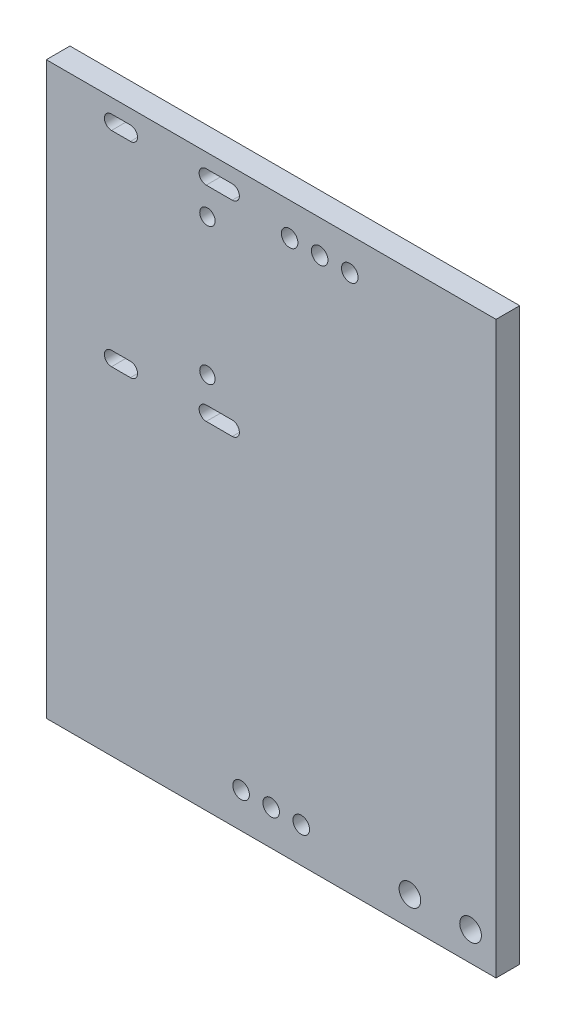
ISO-10303-21;
HEADER;
FILE_DESCRIPTION(('STEP AP214'),'2;1');
FILE_NAME('part.step','',(''),(''),'','','');
FILE_SCHEMA(('AUTOMOTIVE_DESIGN { 1 0 10303 214 1 1 1 1 }'));
ENDSEC;
DATA;
#1=APPLICATION_CONTEXT('core data for automotive mechanical design processes');
#2=APPLICATION_PROTOCOL_DEFINITION('international standard','automotive_design',2000,#1);
#3=PRODUCT_CONTEXT('',#1,'mechanical');
#4=PRODUCT('Part','Part','',(#3));
#5=PRODUCT_RELATED_PRODUCT_CATEGORY('part','',(#4));
#6=PRODUCT_DEFINITION_FORMATION('','',#4);
#7=PRODUCT_DEFINITION_CONTEXT('part definition',#1,'design');
#8=PRODUCT_DEFINITION('design','',#6,#7);
#9=PRODUCT_DEFINITION_SHAPE('','',#8);
#10=(LENGTH_UNIT() NAMED_UNIT(*) SI_UNIT(.MILLI.,.METRE.));
#11=(NAMED_UNIT(*) PLANE_ANGLE_UNIT() SI_UNIT($,.RADIAN.));
#12=(NAMED_UNIT(*) SI_UNIT($,.STERADIAN.) SOLID_ANGLE_UNIT());
#13=UNCERTAINTY_MEASURE_WITH_UNIT(LENGTH_MEASURE(1.E-05),#10,'distance_accuracy_value','');
#14=(GEOMETRIC_REPRESENTATION_CONTEXT(3) GLOBAL_UNCERTAINTY_ASSIGNED_CONTEXT((#13)) GLOBAL_UNIT_ASSIGNED_CONTEXT((#10,
#11,#12)) REPRESENTATION_CONTEXT('',''));
#15=CARTESIAN_POINT('',(0.,0.,0.));
#16=DIRECTION('',(0.,0.,1.));
#17=DIRECTION('',(1.,0.,0.));
#18=AXIS2_PLACEMENT_3D('',#15,#16,#17);
#19=CARTESIAN_POINT('',(-2.049004318009,8.394079248158,0.));
#20=DIRECTION('',(0.,0.,-1.));
#21=DIRECTION('',(-1.,0.,0.));
#22=AXIS2_PLACEMENT_3D('',#19,#20,#21);
#23=PLANE('',#22);
#24=CARTESIAN_POINT('',(6.371145542291,-2.41300482601,0.));
#25=DIRECTION('',(0.,0.,-1.));
#26=DIRECTION('',(-1.,0.,0.));
#27=AXIS2_PLACEMENT_3D('',#24,#25,#26);
#28=CIRCLE('',#27,0.457200914402);
#29=CARTESIAN_POINT('',(5.913944627889,-2.41300482601,0.));
#30=VERTEX_POINT('',#29);
#31=EDGE_CURVE('E266',#30,#30,#28,.F.);
#32=ORIENTED_EDGE('',*,*,#31,.T.);
#33=EDGE_LOOP('',(#32));
#34=FACE_BOUND('',#33,.T.);
#35=CARTESIAN_POINT('',(3.810007620015,-2.41300482601,0.));
#36=DIRECTION('',(0.,0.,-1.));
#37=DIRECTION('',(-1.,0.,0.));
#38=AXIS2_PLACEMENT_3D('',#35,#36,#37);
#39=CIRCLE('',#38,0.457200914402);
#40=CARTESIAN_POINT('',(3.352806705613,-2.41300482601,0.));
#41=VERTEX_POINT('',#40);
#42=EDGE_CURVE('E269',#41,#41,#39,.F.);
#43=ORIENTED_EDGE('',*,*,#42,.T.);
#44=EDGE_LOOP('',(#43));
#45=FACE_BOUND('',#44,.T.);
#46=CARTESIAN_POINT('',(1.270002540005,19.050038100076,0.));
#47=DIRECTION('',(0.,0.,-1.));
#48=DIRECTION('',(-1.,0.,0.));
#49=AXIS2_PLACEMENT_3D('',#46,#47,#48);
#50=CIRCLE('',#49,0.350012700025);
#51=CARTESIAN_POINT('',(0.91998983998,19.050038100076,0.));
#52=VERTEX_POINT('',#51);
#53=EDGE_CURVE('E272',#52,#52,#50,.F.);
#54=ORIENTED_EDGE('',*,*,#53,.T.);
#55=EDGE_LOOP('',(#54));
#56=FACE_BOUND('',#55,.T.);
#57=CARTESIAN_POINT('',(0.,19.050038100076,0.));
#58=DIRECTION('',(0.,0.,-1.));
#59=DIRECTION('',(-1.,0.,0.));
#60=AXIS2_PLACEMENT_3D('',#57,#58,#59);
#61=CIRCLE('',#60,0.350012700025);
#62=CARTESIAN_POINT('',(-0.350012700025,19.050038100076,0.));
#63=VERTEX_POINT('',#62);
#64=EDGE_CURVE('E275',#63,#63,#61,.F.);
#65=ORIENTED_EDGE('',*,*,#64,.T.);
#66=EDGE_LOOP('',(#65));
#67=FACE_BOUND('',#66,.T.);
#68=CARTESIAN_POINT('',(-0.77887477775,-2.159004318009,0.));
#69=DIRECTION('',(0.,0.,-1.));
#70=DIRECTION('',(-1.,0.,0.));
#71=AXIS2_PLACEMENT_3D('',#68,#69,#70);
#72=CIRCLE('',#71,0.350012700025);
#73=CARTESIAN_POINT('',(-1.128887477775,-2.159004318009,0.));
#74=VERTEX_POINT('',#73);
#75=EDGE_CURVE('E278',#74,#74,#72,.F.);
#76=ORIENTED_EDGE('',*,*,#75,.T.);
#77=EDGE_LOOP('',(#76));
#78=FACE_BOUND('',#77,.T.);
#79=CARTESIAN_POINT('',(-1.270002540005,19.050038100076,0.));
#80=DIRECTION('',(0.,0.,-1.));
#81=DIRECTION('',(-1.,0.,0.));
#82=AXIS2_PLACEMENT_3D('',#79,#80,#81);
#83=CIRCLE('',#82,0.350012700025);
#84=CARTESIAN_POINT('',(-1.62001524003,19.050038100076,0.));
#85=VERTEX_POINT('',#84);
#86=EDGE_CURVE('E281',#85,#85,#83,.F.);
#87=ORIENTED_EDGE('',*,*,#86,.T.);
#88=EDGE_LOOP('',(#87));
#89=FACE_BOUND('',#88,.T.);
#90=CARTESIAN_POINT('',(-2.048877317755,-2.159004318009,0.));
#91=DIRECTION('',(0.,0.,-1.));
#92=DIRECTION('',(-1.,0.,0.));
#93=AXIS2_PLACEMENT_3D('',#90,#91,#92);
#94=CIRCLE('',#93,0.350012700025);
#95=CARTESIAN_POINT('',(-2.39889001778,-2.159004318009,0.));
#96=VERTEX_POINT('',#95);
#97=EDGE_CURVE('E284',#96,#96,#94,.F.);
#98=ORIENTED_EDGE('',*,*,#97,.T.);
#99=EDGE_LOOP('',(#98));
#100=FACE_BOUND('',#99,.T.);
#101=CARTESIAN_POINT('',(-3.31887985776,-2.159004318009,0.));
#102=DIRECTION('',(0.,0.,-1.));
#103=DIRECTION('',(-1.,0.,0.));
#104=AXIS2_PLACEMENT_3D('',#101,#102,#103);
#105=CIRCLE('',#104,0.350012700025);
#106=CARTESIAN_POINT('',(-3.668892557785,-2.159004318009,0.));
#107=VERTEX_POINT('',#106);
#108=EDGE_CURVE('E287',#107,#107,#105,.F.);
#109=ORIENTED_EDGE('',*,*,#108,.T.);
#110=EDGE_LOOP('',(#109));
#111=FACE_BOUND('',#110,.T.);
#112=CARTESIAN_POINT('',(-4.740167640335,12.316187452375,0.));
#113=DIRECTION('',(0.,0.,-1.));
#114=DIRECTION('',(-1.,0.,0.));
#115=AXIS2_PLACEMENT_3D('',#112,#113,#114);
#116=CIRCLE('',#115,0.324993649987);
#117=CARTESIAN_POINT('',(-5.065161290322,12.316187452375,0.));
#118=VERTEX_POINT('',#117);
#119=EDGE_CURVE('E290',#118,#118,#116,.F.);
#120=ORIENTED_EDGE('',*,*,#119,.T.);
#121=EDGE_LOOP('',(#120));
#122=FACE_BOUND('',#121,.T.);
#123=CARTESIAN_POINT('',(-4.740167640335,18.096223012446,0.));
#124=DIRECTION('',(0.,0.,-1.));
#125=DIRECTION('',(-1.,0.,0.));
#126=AXIS2_PLACEMENT_3D('',#123,#124,#125);
#127=CIRCLE('',#126,0.324993649987);
#128=CARTESIAN_POINT('',(-5.065161290322,18.096223012446,0.));
#129=VERTEX_POINT('',#128);
#130=EDGE_CURVE('E293',#129,#129,#127,.F.);
#131=ORIENTED_EDGE('',*,*,#130,.T.);
#132=EDGE_LOOP('',(#131));
#133=FACE_BOUND('',#132,.T.);
#134=DIRECTION('',(1.,0.,0.));
#135=VECTOR('',#134,1.);
#136=CARTESIAN_POINT('',(-4.790815341631,10.586164592329,0.));
#137=LINE('',#136,#135);
#138=CARTESIAN_POINT('',(-3.69078994158,10.586164592329,0.));
#139=VERTEX_POINT('',#138);
#140=CARTESIAN_POINT('',(-4.790815341631,10.586164592329,0.));
#141=VERTEX_POINT('',#140);
#142=EDGE_CURVE('E175',#139,#141,#137,.F.);
#143=ORIENTED_EDGE('',*,*,#142,.F.);
#144=CARTESIAN_POINT('',(-3.69078994158,10.886164592329,0.));
#145=DIRECTION('',(0.,0.,-1.));
#146=DIRECTION('',(-1.,0.,0.));
#147=AXIS2_PLACEMENT_3D('',#144,#145,#146);
#148=CIRCLE('',#147,0.3);
#149=CARTESIAN_POINT('',(-3.69078994158,11.186164592329,0.));
#150=VERTEX_POINT('',#149);
#151=EDGE_CURVE('E178',#139,#150,#148,.F.);
#152=ORIENTED_EDGE('',*,*,#151,.T.);
#153=DIRECTION('',(1.,0.,0.));
#154=VECTOR('',#153,1.);
#155=CARTESIAN_POINT('',(-3.69078994158,11.186164592329,0.));
#156=LINE('',#155,#154);
#157=CARTESIAN_POINT('',(-4.790815341631,11.186164592329,0.));
#158=VERTEX_POINT('',#157);
#159=EDGE_CURVE('E180',#158,#150,#156,.T.);
#160=ORIENTED_EDGE('',*,*,#159,.F.);
#161=CARTESIAN_POINT('',(-4.790815341631,10.886164592329,0.));
#162=DIRECTION('',(0.,0.,-1.));
#163=DIRECTION('',(-1.,0.,0.));
#164=AXIS2_PLACEMENT_3D('',#161,#162,#163);
#165=CIRCLE('',#164,0.3);
#166=EDGE_CURVE('E182',#158,#141,#165,.F.);
#167=ORIENTED_EDGE('',*,*,#166,.T.);
#168=EDGE_LOOP('',(#143,#152,#160,#167));
#169=FACE_BOUND('',#168,.T.);
#170=DIRECTION('',(1.,0.,0.));
#171=VECTOR('',#170,1.);
#172=CARTESIAN_POINT('',(-4.790815341631,19.226245872492,0.));
#173=LINE('',#172,#171);
#174=CARTESIAN_POINT('',(-3.69078994158,19.226245872492,0.));
#175=VERTEX_POINT('',#174);
#176=CARTESIAN_POINT('',(-4.790815341631,19.226245872492,0.));
#177=VERTEX_POINT('',#176);
#178=EDGE_CURVE('E184',#175,#177,#173,.F.);
#179=ORIENTED_EDGE('',*,*,#178,.F.);
#180=CARTESIAN_POINT('',(-3.69078994158,19.526245872492,0.));
#181=DIRECTION('',(0.,0.,-1.));
#182=DIRECTION('',(-1.,0.,0.));
#183=AXIS2_PLACEMENT_3D('',#180,#181,#182);
#184=CIRCLE('',#183,0.3);
#185=CARTESIAN_POINT('',(-3.69078994158,19.826245872492,0.));
#186=VERTEX_POINT('',#185);
#187=EDGE_CURVE('E187',#175,#186,#184,.F.);
#188=ORIENTED_EDGE('',*,*,#187,.T.);
#189=DIRECTION('',(1.,0.,0.));
#190=VECTOR('',#189,1.);
#191=CARTESIAN_POINT('',(-3.69078994158,19.826245872492,0.));
#192=LINE('',#191,#190);
#193=CARTESIAN_POINT('',(-4.790815341631,19.826245872492,0.));
#194=VERTEX_POINT('',#193);
#195=EDGE_CURVE('E189',#194,#186,#192,.T.);
#196=ORIENTED_EDGE('',*,*,#195,.F.);
#197=CARTESIAN_POINT('',(-4.790815341631,19.526245872492,0.));
#198=DIRECTION('',(0.,0.,-1.));
#199=DIRECTION('',(-1.,0.,0.));
#200=AXIS2_PLACEMENT_3D('',#197,#198,#199);
#201=CIRCLE('',#200,0.3);
#202=EDGE_CURVE('E191',#194,#177,#201,.F.);
#203=ORIENTED_EDGE('',*,*,#202,.T.);
#204=EDGE_LOOP('',(#179,#188,#196,#203));
#205=FACE_BOUND('',#204,.T.);
#206=DIRECTION('',(1.,0.,0.));
#207=VECTOR('',#206,1.);
#208=CARTESIAN_POINT('',(-8.790662941326,10.586164592329,0.));
#209=LINE('',#208,#207);
#210=CARTESIAN_POINT('',(-7.990662941326,10.586164592329,0.));
#211=VERTEX_POINT('',#210);
#212=CARTESIAN_POINT('',(-8.790662941326,10.586164592329,0.));
#213=VERTEX_POINT('',#212);
#214=EDGE_CURVE('E193',#211,#213,#209,.F.);
#215=ORIENTED_EDGE('',*,*,#214,.F.);
#216=CARTESIAN_POINT('',(-7.990662941326,10.886164592329,0.));
#217=DIRECTION('',(0.,0.,-1.));
#218=DIRECTION('',(-1.,0.,0.));
#219=AXIS2_PLACEMENT_3D('',#216,#217,#218);
#220=CIRCLE('',#219,0.3);
#221=CARTESIAN_POINT('',(-7.990662941326,11.186164592329,0.));
#222=VERTEX_POINT('',#221);
#223=EDGE_CURVE('E196',#211,#222,#220,.F.);
#224=ORIENTED_EDGE('',*,*,#223,.T.);
#225=DIRECTION('',(1.,0.,0.));
#226=VECTOR('',#225,1.);
#227=CARTESIAN_POINT('',(-7.990662941326,11.186164592329,0.));
#228=LINE('',#227,#226);
#229=CARTESIAN_POINT('',(-8.790662941326,11.186164592329,0.));
#230=VERTEX_POINT('',#229);
#231=EDGE_CURVE('E198',#230,#222,#228,.T.);
#232=ORIENTED_EDGE('',*,*,#231,.F.);
#233=CARTESIAN_POINT('',(-8.790662941326,10.886164592329,0.));
#234=DIRECTION('',(0.,0.,-1.));
#235=DIRECTION('',(-1.,0.,0.));
#236=AXIS2_PLACEMENT_3D('',#233,#234,#235);
#237=CIRCLE('',#236,0.3);
#238=EDGE_CURVE('E200',#230,#213,#237,.F.);
#239=ORIENTED_EDGE('',*,*,#238,.T.);
#240=EDGE_LOOP('',(#215,#224,#232,#239));
#241=FACE_BOUND('',#240,.T.);
#242=DIRECTION('',(1.,0.,0.));
#243=VECTOR('',#242,1.);
#244=CARTESIAN_POINT('',(-8.790662941326,19.226245872492,0.));
#245=LINE('',#244,#243);
#246=CARTESIAN_POINT('',(-7.990662941326,19.226245872492,0.));
#247=VERTEX_POINT('',#246);
#248=CARTESIAN_POINT('',(-8.790662941326,19.226245872492,0.));
#249=VERTEX_POINT('',#248);
#250=EDGE_CURVE('E202',#247,#249,#245,.F.);
#251=ORIENTED_EDGE('',*,*,#250,.F.);
#252=CARTESIAN_POINT('',(-7.990662941326,19.526245872492,0.));
#253=DIRECTION('',(0.,0.,-1.));
#254=DIRECTION('',(-1.,0.,0.));
#255=AXIS2_PLACEMENT_3D('',#252,#253,#254);
#256=CIRCLE('',#255,0.3);
#257=CARTESIAN_POINT('',(-7.990662941326,19.826245872492,0.));
#258=VERTEX_POINT('',#257);
#259=EDGE_CURVE('E205',#247,#258,#256,.F.);
#260=ORIENTED_EDGE('',*,*,#259,.T.);
#261=DIRECTION('',(1.,0.,0.));
#262=VECTOR('',#261,1.);
#263=CARTESIAN_POINT('',(-7.990662941326,19.826245872492,0.));
#264=LINE('',#263,#262);
#265=CARTESIAN_POINT('',(-8.790662941326,19.826245872492,0.));
#266=VERTEX_POINT('',#265);
#267=EDGE_CURVE('E207',#266,#258,#264,.T.);
#268=ORIENTED_EDGE('',*,*,#267,.F.);
#269=CARTESIAN_POINT('',(-8.790662941326,19.526245872492,0.));
#270=DIRECTION('',(0.,0.,-1.));
#271=DIRECTION('',(-1.,0.,0.));
#272=AXIS2_PLACEMENT_3D('',#269,#270,#271);
#273=CIRCLE('',#272,0.3);
#274=EDGE_CURVE('E20',#266,#249,#273,.F.);
#275=ORIENTED_EDGE('',*,*,#274,.T.);
#276=EDGE_LOOP('',(#251,#260,#268,#275));
#277=FACE_BOUND('',#276,.T.);
#278=DIRECTION('',(0.,1.,0.));
#279=VECTOR('',#278,1.);
#280=CARTESIAN_POINT('',(-11.54432308864,-3.649286258573,0.));
#281=LINE('',#280,#279);
#282=CARTESIAN_POINT('',(-11.54432308864,20.43744475489,0.));
#283=VERTEX_POINT('',#282);
#284=CARTESIAN_POINT('',(-11.54432308864,-3.649286258573,0.));
#285=VERTEX_POINT('',#284);
#286=EDGE_CURVE('E334',#283,#285,#281,.F.);
#287=ORIENTED_EDGE('',*,*,#286,.F.);
#288=DIRECTION('',(1.,0.,0.));
#289=VECTOR('',#288,1.);
#290=CARTESIAN_POINT('',(-11.54432308864,20.43744475489,0.));
#291=LINE('',#290,#289);
#292=CARTESIAN_POINT('',(7.446314452629,20.43744475489,0.));
#293=VERTEX_POINT('',#292);
#294=EDGE_CURVE('E156',#293,#283,#291,.F.);
#295=ORIENTED_EDGE('',*,*,#294,.F.);
#296=DIRECTION('',(0.,1.,0.));
#297=VECTOR('',#296,1.);
#298=CARTESIAN_POINT('',(7.446314452629,20.43744475489,0.));
#299=LINE('',#298,#297);
#300=CARTESIAN_POINT('',(7.446314452629,-3.649286258573,0.));
#301=VERTEX_POINT('',#300);
#302=EDGE_CURVE('E141',#301,#293,#299,.T.);
#303=ORIENTED_EDGE('',*,*,#302,.F.);
#304=DIRECTION('',(1.,0.,0.));
#305=VECTOR('',#304,1.);
#306=CARTESIAN_POINT('',(7.446314452629,-3.649286258573,0.));
#307=LINE('',#306,#305);
#308=EDGE_CURVE('E152',#285,#301,#307,.T.);
#309=ORIENTED_EDGE('',*,*,#308,.F.);
#310=EDGE_LOOP('',(#287,#295,#303,#309));
#311=FACE_BOUND('',#310,.T.);
#312=ADVANCED_FACE('F17',(#34,#45,#56,#67,#78,#89,#100,#111,#122,#133,#169,#205,#241,#277,#311),
#23,.T.);
#313=CARTESIAN_POINT('',(7.446314452629,20.43744475489,0.));
#314=DIRECTION('',(1.,0.,0.));
#315=DIRECTION('',(0.,1.,0.));
#316=AXIS2_PLACEMENT_3D('',#313,#314,#315);
#317=PLANE('',#316);
#318=DIRECTION('',(0.,0.,-1.));
#319=VECTOR('',#318,1.);
#320=CARTESIAN_POINT('',(7.446314452629,-3.649286258573,0.));
#321=LINE('',#320,#319);
#322=CARTESIAN_POINT('',(7.446314452629,-3.649286258573,1.000001778004));
#323=VERTEX_POINT('',#322);
#324=EDGE_CURVE('E157',#301,#323,#321,.F.);
#325=ORIENTED_EDGE('',*,*,#324,.F.);
#326=ORIENTED_EDGE('',*,*,#302,.T.);
#327=DIRECTION('',(0.,0.,1.));
#328=VECTOR('',#327,1.);
#329=CARTESIAN_POINT('',(7.446314452629,20.43744475489,0.));
#330=LINE('',#329,#328);
#331=CARTESIAN_POINT('',(7.446314452629,20.43744475489,1.000001778004));
#332=VERTEX_POINT('',#331);
#333=EDGE_CURVE('E329',#332,#293,#330,.F.);
#334=ORIENTED_EDGE('',*,*,#333,.F.);
#335=DIRECTION('',(0.,1.,0.));
#336=VECTOR('',#335,1.);
#337=CARTESIAN_POINT('',(7.446314452629,8.394079248158,1.000001778004));
#338=LINE('',#337,#336);
#339=EDGE_CURVE('E171',#332,#323,#338,.F.);
#340=ORIENTED_EDGE('',*,*,#339,.T.);
#341=EDGE_LOOP('',(#325,#326,#334,#340));
#342=FACE_BOUND('',#341,.T.);
#343=ADVANCED_FACE('F169',(#342),#317,.T.);
#344=CARTESIAN_POINT('',(7.446314452629,-3.649286258573,0.));
#345=DIRECTION('',(0.,-1.,0.));
#346=DIRECTION('',(0.,0.,-1.));
#347=AXIS2_PLACEMENT_3D('',#344,#345,#346);
#348=PLANE('',#347);
#349=DIRECTION('',(0.,0.,1.));
#350=VECTOR('',#349,1.);
#351=CARTESIAN_POINT('',(-11.54432308864,-3.649286258573,0.));
#352=LINE('',#351,#350);
#353=CARTESIAN_POINT('',(-11.54432308864,-3.649286258573,1.000001778004));
#354=VERTEX_POINT('',#353);
#355=EDGE_CURVE('E166',#285,#354,#352,.T.);
#356=ORIENTED_EDGE('',*,*,#355,.F.);
#357=ORIENTED_EDGE('',*,*,#308,.T.);
#358=ORIENTED_EDGE('',*,*,#324,.T.);
#359=DIRECTION('',(-1.,0.,0.));
#360=VECTOR('',#359,1.);
#361=CARTESIAN_POINT('',(-2.049004318009,-3.649286258573,1.000001778004));
#362=LINE('',#361,#360);
#363=EDGE_CURVE('E346',#323,#354,#362,.T.);
#364=ORIENTED_EDGE('',*,*,#363,.T.);
#365=EDGE_LOOP('',(#356,#357,#358,#364));
#366=FACE_BOUND('',#365,.T.);
#367=ADVANCED_FACE('F162',(#366),#348,.T.);
#368=CARTESIAN_POINT('',(-11.54432308864,-3.649286258573,0.));
#369=DIRECTION('',(-1.,0.,0.));
#370=DIRECTION('',(0.,0.,1.));
#371=AXIS2_PLACEMENT_3D('',#368,#369,#370);
#372=PLANE('',#371);
#373=DIRECTION('',(0.,0.,1.));
#374=VECTOR('',#373,1.);
#375=CARTESIAN_POINT('',(-11.54432308864,20.43744475489,0.));
#376=LINE('',#375,#374);
#377=CARTESIAN_POINT('',(-11.54432308864,20.43744475489,1.000001778004));
#378=VERTEX_POINT('',#377);
#379=EDGE_CURVE('E331',#283,#378,#376,.T.);
#380=ORIENTED_EDGE('',*,*,#379,.F.);
#381=ORIENTED_EDGE('',*,*,#286,.T.);
#382=ORIENTED_EDGE('',*,*,#355,.T.);
#383=DIRECTION('',(0.,1.,0.));
#384=VECTOR('',#383,1.);
#385=CARTESIAN_POINT('',(-11.54432308864,8.394079248158,1.000001778004));
#386=LINE('',#385,#384);
#387=EDGE_CURVE('E341',#354,#378,#386,.T.);
#388=ORIENTED_EDGE('',*,*,#387,.T.);
#389=EDGE_LOOP('',(#380,#381,#382,#388));
#390=FACE_BOUND('',#389,.T.);
#391=ADVANCED_FACE('F340',(#390),#372,.T.);
#392=CARTESIAN_POINT('',(-11.54432308864,20.43744475489,0.));
#393=DIRECTION('',(0.,1.,0.));
#394=DIRECTION('',(0.,0.,1.));
#395=AXIS2_PLACEMENT_3D('',#392,#393,#394);
#396=PLANE('',#395);
#397=ORIENTED_EDGE('',*,*,#333,.T.);
#398=ORIENTED_EDGE('',*,*,#294,.T.);
#399=ORIENTED_EDGE('',*,*,#379,.T.);
#400=DIRECTION('',(-1.,0.,0.));
#401=VECTOR('',#400,1.);
#402=CARTESIAN_POINT('',(-2.049004318009,20.43744475489,1.000001778004));
#403=LINE('',#402,#401);
#404=EDGE_CURVE('E348',#378,#332,#403,.F.);
#405=ORIENTED_EDGE('',*,*,#404,.T.);
#406=EDGE_LOOP('',(#397,#398,#399,#405));
#407=FACE_BOUND('',#406,.T.);
#408=ADVANCED_FACE('F394',(#407),#396,.T.);
#409=CARTESIAN_POINT('',(-7.990662941326,19.826245872492,0.));
#410=DIRECTION('',(0.,-1.,0.));
#411=DIRECTION('',(0.,0.,-1.));
#412=AXIS2_PLACEMENT_3D('',#409,#410,#411);
#413=PLANE('',#412);
#414=DIRECTION('',(0.,0.,-1.));
#415=VECTOR('',#414,1.);
#416=CARTESIAN_POINT('',(-8.790662941326,19.826245872492,0.));
#417=LINE('',#416,#415);
#418=CARTESIAN_POINT('',(-8.790662941326,19.826245872492,1.000001778004));
#419=VERTEX_POINT('',#418);
#420=EDGE_CURVE('E325',#419,#266,#417,.T.);
#421=ORIENTED_EDGE('',*,*,#420,.T.);
#422=ORIENTED_EDGE('',*,*,#267,.T.);
#423=DIRECTION('',(0.,0.,-1.));
#424=VECTOR('',#423,1.);
#425=CARTESIAN_POINT('',(-7.990662941326,19.826245872492,0.));
#426=LINE('',#425,#424);
#427=CARTESIAN_POINT('',(-7.990662941326,19.826245872492,1.000001778004));
#428=VERTEX_POINT('',#427);
#429=EDGE_CURVE('E311',#258,#428,#426,.F.);
#430=ORIENTED_EDGE('',*,*,#429,.T.);
#431=DIRECTION('',(-1.,0.,0.));
#432=VECTOR('',#431,1.);
#433=CARTESIAN_POINT('',(-2.049004318009,19.826245872492,1.000001778004));
#434=LINE('',#433,#432);
#435=EDGE_CURVE('E265',#428,#419,#434,.T.);
#436=ORIENTED_EDGE('',*,*,#435,.T.);
#437=EDGE_LOOP('',(#421,#422,#430,#436));
#438=FACE_BOUND('',#437,.T.);
#439=ADVANCED_FACE('F397',(#438),#413,.T.);
#440=CARTESIAN_POINT('',(-8.790662941326,19.526245872492,0.));
#441=DIRECTION('',(0.,0.,-1.));
#442=DIRECTION('',(-1.,0.,0.));
#443=AXIS2_PLACEMENT_3D('',#440,#441,#442);
#444=CYLINDRICAL_SURFACE('',#443,0.3);
#445=CARTESIAN_POINT('',(-8.790662941326,19.526245872492,1.000001778004));
#446=DIRECTION('',(0.,0.,-1.));
#447=DIRECTION('',(-1.,0.,0.));
#448=AXIS2_PLACEMENT_3D('',#445,#446,#447);
#449=CIRCLE('',#448,0.3);
#450=CARTESIAN_POINT('',(-8.790662941326,19.226245872492,1.000001778004));
#451=VERTEX_POINT('',#450);
#452=EDGE_CURVE('E262',#419,#451,#449,.F.);
#453=ORIENTED_EDGE('',*,*,#452,.T.);
#454=DIRECTION('',(0.,0.,1.));
#455=VECTOR('',#454,1.);
#456=CARTESIAN_POINT('',(-8.790662941326,19.226245872492,0.));
#457=LINE('',#456,#455);
#458=EDGE_CURVE('E206',#249,#451,#457,.T.);
#459=ORIENTED_EDGE('',*,*,#458,.F.);
#460=ORIENTED_EDGE('',*,*,#274,.F.);
#461=ORIENTED_EDGE('',*,*,#420,.F.);
#462=EDGE_LOOP('',(#453,#459,#460,#461));
#463=FACE_BOUND('',#462,.T.);
#464=ADVANCED_FACE('F404',(#463),#444,.F.);
#465=CARTESIAN_POINT('',(-8.790662941326,19.226245872492,0.));
#466=DIRECTION('',(0.,1.,0.));
#467=DIRECTION('',(0.,0.,1.));
#468=AXIS2_PLACEMENT_3D('',#465,#466,#467);
#469=PLANE('',#468);
#470=DIRECTION('',(0.,0.,-1.));
#471=VECTOR('',#470,1.);
#472=CARTESIAN_POINT('',(-7.990662941326,19.226245872492,0.));
#473=LINE('',#472,#471);
#474=CARTESIAN_POINT('',(-7.990662941326,19.226245872492,1.000001778004));
#475=VERTEX_POINT('',#474);
#476=EDGE_CURVE('E201',#475,#247,#473,.T.);
#477=ORIENTED_EDGE('',*,*,#476,.T.);
#478=ORIENTED_EDGE('',*,*,#250,.T.);
#479=ORIENTED_EDGE('',*,*,#458,.T.);
#480=DIRECTION('',(-1.,0.,0.));
#481=VECTOR('',#480,1.);
#482=CARTESIAN_POINT('',(-2.049004318009,19.226245872492,1.000001778004));
#483=LINE('',#482,#481);
#484=EDGE_CURVE('E261',#451,#475,#483,.F.);
#485=ORIENTED_EDGE('',*,*,#484,.T.);
#486=EDGE_LOOP('',(#477,#478,#479,#485));
#487=FACE_BOUND('',#486,.T.);
#488=ADVANCED_FACE('F500',(#487),#469,.T.);
#489=CARTESIAN_POINT('',(-7.990662941326,19.526245872492,0.));
#490=DIRECTION('',(0.,0.,-1.));
#491=DIRECTION('',(-1.,0.,0.));
#492=AXIS2_PLACEMENT_3D('',#489,#490,#491);
#493=CYLINDRICAL_SURFACE('',#492,0.3);
#494=CARTESIAN_POINT('',(-7.990662941326,19.526245872492,1.000001778004));
#495=DIRECTION('',(0.,0.,-1.));
#496=DIRECTION('',(-1.,0.,0.));
#497=AXIS2_PLACEMENT_3D('',#494,#495,#496);
#498=CIRCLE('',#497,0.3);
#499=EDGE_CURVE('E258',#475,#428,#498,.F.);
#500=ORIENTED_EDGE('',*,*,#499,.T.);
#501=ORIENTED_EDGE('',*,*,#429,.F.);
#502=ORIENTED_EDGE('',*,*,#259,.F.);
#503=ORIENTED_EDGE('',*,*,#476,.F.);
#504=EDGE_LOOP('',(#500,#501,#502,#503));
#505=FACE_BOUND('',#504,.T.);
#506=ADVANCED_FACE('F497',(#505),#493,.F.);
#507=CARTESIAN_POINT('',(-7.990662941326,11.186164592329,0.));
#508=DIRECTION('',(0.,-1.,0.));
#509=DIRECTION('',(0.,0.,-1.));
#510=AXIS2_PLACEMENT_3D('',#507,#508,#509);
#511=PLANE('',#510);
#512=DIRECTION('',(0.,0.,-1.));
#513=VECTOR('',#512,1.);
#514=CARTESIAN_POINT('',(-8.790662941326,11.186164592329,0.));
#515=LINE('',#514,#513);
#516=CARTESIAN_POINT('',(-8.790662941326,11.186164592329,1.000001778004));
#517=VERTEX_POINT('',#516);
#518=EDGE_CURVE('E309',#517,#230,#515,.T.);
#519=ORIENTED_EDGE('',*,*,#518,.T.);
#520=ORIENTED_EDGE('',*,*,#231,.T.);
#521=DIRECTION('',(0.,0.,-1.));
#522=VECTOR('',#521,1.);
#523=CARTESIAN_POINT('',(-7.990662941326,11.186164592329,0.));
#524=LINE('',#523,#522);
#525=CARTESIAN_POINT('',(-7.990662941326,11.186164592329,1.000001778004));
#526=VERTEX_POINT('',#525);
#527=EDGE_CURVE('E308',#222,#526,#524,.F.);
#528=ORIENTED_EDGE('',*,*,#527,.T.);
#529=DIRECTION('',(-1.,0.,0.));
#530=VECTOR('',#529,1.);
#531=CARTESIAN_POINT('',(-2.049004318009,11.186164592329,1.000001778004));
#532=LINE('',#531,#530);
#533=EDGE_CURVE('E257',#526,#517,#532,.T.);
#534=ORIENTED_EDGE('',*,*,#533,.T.);
#535=EDGE_LOOP('',(#519,#520,#528,#534));
#536=FACE_BOUND('',#535,.T.);
#537=ADVANCED_FACE('F377',(#536),#511,.T.);
#538=CARTESIAN_POINT('',(-8.790662941326,10.886164592329,0.));
#539=DIRECTION('',(0.,0.,-1.));
#540=DIRECTION('',(-1.,0.,0.));
#541=AXIS2_PLACEMENT_3D('',#538,#539,#540);
#542=CYLINDRICAL_SURFACE('',#541,0.3);
#543=CARTESIAN_POINT('',(-8.790662941326,10.886164592329,1.000001778004));
#544=DIRECTION('',(0.,0.,-1.));
#545=DIRECTION('',(-1.,0.,0.));
#546=AXIS2_PLACEMENT_3D('',#543,#544,#545);
#547=CIRCLE('',#546,0.3);
#548=CARTESIAN_POINT('',(-8.790662941326,10.586164592329,1.000001778004));
#549=VERTEX_POINT('',#548);
#550=EDGE_CURVE('E254',#517,#549,#547,.F.);
#551=ORIENTED_EDGE('',*,*,#550,.T.);
#552=DIRECTION('',(0.,0.,1.));
#553=VECTOR('',#552,1.);
#554=CARTESIAN_POINT('',(-8.790662941326,10.586164592329,0.));
#555=LINE('',#554,#553);
#556=EDGE_CURVE('E197',#213,#549,#555,.T.);
#557=ORIENTED_EDGE('',*,*,#556,.F.);
#558=ORIENTED_EDGE('',*,*,#238,.F.);
#559=ORIENTED_EDGE('',*,*,#518,.F.);
#560=EDGE_LOOP('',(#551,#557,#558,#559));
#561=FACE_BOUND('',#560,.T.);
#562=ADVANCED_FACE('F382',(#561),#542,.F.);
#563=CARTESIAN_POINT('',(-8.790662941326,10.586164592329,0.));
#564=DIRECTION('',(0.,1.,0.));
#565=DIRECTION('',(0.,0.,1.));
#566=AXIS2_PLACEMENT_3D('',#563,#564,#565);
#567=PLANE('',#566);
#568=DIRECTION('',(0.,0.,-1.));
#569=VECTOR('',#568,1.);
#570=CARTESIAN_POINT('',(-7.990662941326,10.586164592329,0.));
#571=LINE('',#570,#569);
#572=CARTESIAN_POINT('',(-7.990662941326,10.586164592329,1.000001778004));
#573=VERTEX_POINT('',#572);
#574=EDGE_CURVE('E192',#573,#211,#571,.T.);
#575=ORIENTED_EDGE('',*,*,#574,.T.);
#576=ORIENTED_EDGE('',*,*,#214,.T.);
#577=ORIENTED_EDGE('',*,*,#556,.T.);
#578=DIRECTION('',(-1.,0.,0.));
#579=VECTOR('',#578,1.);
#580=CARTESIAN_POINT('',(-2.049004318009,10.586164592329,1.000001778004));
#581=LINE('',#580,#579);
#582=EDGE_CURVE('E253',#549,#573,#581,.F.);
#583=ORIENTED_EDGE('',*,*,#582,.T.);
#584=EDGE_LOOP('',(#575,#576,#577,#583));
#585=FACE_BOUND('',#584,.T.);
#586=ADVANCED_FACE('F489',(#585),#567,.T.);
#587=CARTESIAN_POINT('',(-7.990662941326,10.886164592329,0.));
#588=DIRECTION('',(0.,0.,-1.));
#589=DIRECTION('',(-1.,0.,0.));
#590=AXIS2_PLACEMENT_3D('',#587,#588,#589);
#591=CYLINDRICAL_SURFACE('',#590,0.3);
#592=CARTESIAN_POINT('',(-7.990662941326,10.886164592329,1.000001778004));
#593=DIRECTION('',(0.,0.,-1.));
#594=DIRECTION('',(-1.,0.,0.));
#595=AXIS2_PLACEMENT_3D('',#592,#593,#594);
#596=CIRCLE('',#595,0.3);
#597=EDGE_CURVE('E250',#573,#526,#596,.F.);
#598=ORIENTED_EDGE('',*,*,#597,.T.);
#599=ORIENTED_EDGE('',*,*,#527,.F.);
#600=ORIENTED_EDGE('',*,*,#223,.F.);
#601=ORIENTED_EDGE('',*,*,#574,.F.);
#602=EDGE_LOOP('',(#598,#599,#600,#601));
#603=FACE_BOUND('',#602,.T.);
#604=ADVANCED_FACE('F485',(#603),#591,.F.);
#605=CARTESIAN_POINT('',(-3.69078994158,19.826245872492,0.));
#606=DIRECTION('',(0.,-1.,0.));
#607=DIRECTION('',(0.,0.,-1.));
#608=AXIS2_PLACEMENT_3D('',#605,#606,#607);
#609=PLANE('',#608);
#610=DIRECTION('',(0.,0.,-1.));
#611=VECTOR('',#610,1.);
#612=CARTESIAN_POINT('',(-4.790815341631,19.826245872492,0.));
#613=LINE('',#612,#611);
#614=CARTESIAN_POINT('',(-4.790815341631,19.826245872492,1.000001778004));
#615=VERTEX_POINT('',#614);
#616=EDGE_CURVE('E305',#615,#194,#613,.T.);
#617=ORIENTED_EDGE('',*,*,#616,.T.);
#618=ORIENTED_EDGE('',*,*,#195,.T.);
#619=DIRECTION('',(0.,0.,-1.));
#620=VECTOR('',#619,1.);
#621=CARTESIAN_POINT('',(-3.69078994158,19.826245872492,0.));
#622=LINE('',#621,#620);
#623=CARTESIAN_POINT('',(-3.69078994158,19.826245872492,1.000001778004));
#624=VERTEX_POINT('',#623);
#625=EDGE_CURVE('E303',#186,#624,#622,.F.);
#626=ORIENTED_EDGE('',*,*,#625,.T.);
#627=DIRECTION('',(-1.,0.,0.));
#628=VECTOR('',#627,1.);
#629=CARTESIAN_POINT('',(-2.049004318009,19.826245872492,1.000001778004));
#630=LINE('',#629,#628);
#631=EDGE_CURVE('E249',#624,#615,#630,.T.);
#632=ORIENTED_EDGE('',*,*,#631,.T.);
#633=EDGE_LOOP('',(#617,#618,#626,#632));
#634=FACE_BOUND('',#633,.T.);
#635=ADVANCED_FACE('F481',(#634),#609,.T.);
#636=CARTESIAN_POINT('',(-4.790815341631,19.526245872492,0.));
#637=DIRECTION('',(0.,0.,-1.));
#638=DIRECTION('',(-1.,0.,0.));
#639=AXIS2_PLACEMENT_3D('',#636,#637,#638);
#640=CYLINDRICAL_SURFACE('',#639,0.3);
#641=CARTESIAN_POINT('',(-4.790815341631,19.526245872492,1.000001778004));
#642=DIRECTION('',(0.,0.,-1.));
#643=DIRECTION('',(-1.,0.,0.));
#644=AXIS2_PLACEMENT_3D('',#641,#642,#643);
#645=CIRCLE('',#644,0.3);
#646=CARTESIAN_POINT('',(-4.790815341631,19.226245872492,1.000001778004));
#647=VERTEX_POINT('',#646);
#648=EDGE_CURVE('E246',#615,#647,#645,.F.);
#649=ORIENTED_EDGE('',*,*,#648,.T.);
#650=DIRECTION('',(0.,0.,1.));
#651=VECTOR('',#650,1.);
#652=CARTESIAN_POINT('',(-4.790815341631,19.226245872492,0.));
#653=LINE('',#652,#651);
#654=EDGE_CURVE('E188',#177,#647,#653,.T.);
#655=ORIENTED_EDGE('',*,*,#654,.F.);
#656=ORIENTED_EDGE('',*,*,#202,.F.);
#657=ORIENTED_EDGE('',*,*,#616,.F.);
#658=EDGE_LOOP('',(#649,#655,#656,#657));
#659=FACE_BOUND('',#658,.T.);
#660=ADVANCED_FACE('F477',(#659),#640,.F.);
#661=CARTESIAN_POINT('',(-4.790815341631,19.226245872492,0.));
#662=DIRECTION('',(0.,1.,0.));
#663=DIRECTION('',(0.,0.,1.));
#664=AXIS2_PLACEMENT_3D('',#661,#662,#663);
#665=PLANE('',#664);
#666=DIRECTION('',(0.,0.,-1.));
#667=VECTOR('',#666,1.);
#668=CARTESIAN_POINT('',(-3.69078994158,19.226245872492,0.));
#669=LINE('',#668,#667);
#670=CARTESIAN_POINT('',(-3.69078994158,19.226245872492,1.000001778004));
#671=VERTEX_POINT('',#670);
#672=EDGE_CURVE('E183',#671,#175,#669,.T.);
#673=ORIENTED_EDGE('',*,*,#672,.T.);
#674=ORIENTED_EDGE('',*,*,#178,.T.);
#675=ORIENTED_EDGE('',*,*,#654,.T.);
#676=DIRECTION('',(-1.,0.,0.));
#677=VECTOR('',#676,1.);
#678=CARTESIAN_POINT('',(-2.049004318009,19.226245872492,1.000001778004));
#679=LINE('',#678,#677);
#680=EDGE_CURVE('E245',#647,#671,#679,.F.);
#681=ORIENTED_EDGE('',*,*,#680,.T.);
#682=EDGE_LOOP('',(#673,#674,#675,#681));
#683=FACE_BOUND('',#682,.T.);
#684=ADVANCED_FACE('F473',(#683),#665,.T.);
#685=CARTESIAN_POINT('',(-3.69078994158,19.526245872492,0.));
#686=DIRECTION('',(0.,0.,-1.));
#687=DIRECTION('',(-1.,0.,0.));
#688=AXIS2_PLACEMENT_3D('',#685,#686,#687);
#689=CYLINDRICAL_SURFACE('',#688,0.3);
#690=CARTESIAN_POINT('',(-3.69078994158,19.526245872492,1.000001778004));
#691=DIRECTION('',(0.,0.,-1.));
#692=DIRECTION('',(-1.,0.,0.));
#693=AXIS2_PLACEMENT_3D('',#690,#691,#692);
#694=CIRCLE('',#693,0.3);
#695=EDGE_CURVE('E242',#671,#624,#694,.F.);
#696=ORIENTED_EDGE('',*,*,#695,.T.);
#697=ORIENTED_EDGE('',*,*,#625,.F.);
#698=ORIENTED_EDGE('',*,*,#187,.F.);
#699=ORIENTED_EDGE('',*,*,#672,.F.);
#700=EDGE_LOOP('',(#696,#697,#698,#699));
#701=FACE_BOUND('',#700,.T.);
#702=ADVANCED_FACE('F469',(#701),#689,.F.);
#703=CARTESIAN_POINT('',(-3.69078994158,11.186164592329,0.));
#704=DIRECTION('',(0.,-1.,0.));
#705=DIRECTION('',(0.,0.,-1.));
#706=AXIS2_PLACEMENT_3D('',#703,#704,#705);
#707=PLANE('',#706);
#708=DIRECTION('',(0.,0.,-1.));
#709=VECTOR('',#708,1.);
#710=CARTESIAN_POINT('',(-4.790815341631,11.186164592329,0.));
#711=LINE('',#710,#709);
#712=CARTESIAN_POINT('',(-4.790815341631,11.186164592329,1.000001778004));
#713=VERTEX_POINT('',#712);
#714=EDGE_CURVE('E300',#713,#158,#711,.T.);
#715=ORIENTED_EDGE('',*,*,#714,.T.);
#716=ORIENTED_EDGE('',*,*,#159,.T.);
#717=DIRECTION('',(0.,0.,-1.));
#718=VECTOR('',#717,1.);
#719=CARTESIAN_POINT('',(-3.69078994158,11.186164592329,0.));
#720=LINE('',#719,#718);
#721=CARTESIAN_POINT('',(-3.69078994158,11.186164592329,1.000001778004));
#722=VERTEX_POINT('',#721);
#723=EDGE_CURVE('E298',#150,#722,#720,.F.);
#724=ORIENTED_EDGE('',*,*,#723,.T.);
#725=DIRECTION('',(-1.,0.,0.));
#726=VECTOR('',#725,1.);
#727=CARTESIAN_POINT('',(-2.049004318009,11.186164592329,1.000001778004));
#728=LINE('',#727,#726);
#729=EDGE_CURVE('E241',#722,#713,#728,.T.);
#730=ORIENTED_EDGE('',*,*,#729,.T.);
#731=EDGE_LOOP('',(#715,#716,#724,#730));
#732=FACE_BOUND('',#731,.T.);
#733=ADVANCED_FACE('F465',(#732),#707,.T.);
#734=CARTESIAN_POINT('',(-4.790815341631,10.886164592329,0.));
#735=DIRECTION('',(0.,0.,-1.));
#736=DIRECTION('',(-1.,0.,0.));
#737=AXIS2_PLACEMENT_3D('',#734,#735,#736);
#738=CYLINDRICAL_SURFACE('',#737,0.3);
#739=CARTESIAN_POINT('',(-4.790815341631,10.886164592329,1.000001778004));
#740=DIRECTION('',(0.,0.,-1.));
#741=DIRECTION('',(-1.,0.,0.));
#742=AXIS2_PLACEMENT_3D('',#739,#740,#741);
#743=CIRCLE('',#742,0.3);
#744=CARTESIAN_POINT('',(-4.790815341631,10.586164592329,1.000001778004));
#745=VERTEX_POINT('',#744);
#746=EDGE_CURVE('E238',#713,#745,#743,.F.);
#747=ORIENTED_EDGE('',*,*,#746,.T.);
#748=DIRECTION('',(0.,0.,1.));
#749=VECTOR('',#748,1.);
#750=CARTESIAN_POINT('',(-4.790815341631,10.586164592329,0.));
#751=LINE('',#750,#749);
#752=EDGE_CURVE('E179',#141,#745,#751,.T.);
#753=ORIENTED_EDGE('',*,*,#752,.F.);
#754=ORIENTED_EDGE('',*,*,#166,.F.);
#755=ORIENTED_EDGE('',*,*,#714,.F.);
#756=EDGE_LOOP('',(#747,#753,#754,#755));
#757=FACE_BOUND('',#756,.T.);
#758=ADVANCED_FACE('F461',(#757),#738,.F.);
#759=CARTESIAN_POINT('',(-4.790815341631,10.586164592329,0.));
#760=DIRECTION('',(0.,1.,0.));
#761=DIRECTION('',(0.,0.,1.));
#762=AXIS2_PLACEMENT_3D('',#759,#760,#761);
#763=PLANE('',#762);
#764=DIRECTION('',(0.,0.,-1.));
#765=VECTOR('',#764,1.);
#766=CARTESIAN_POINT('',(-3.69078994158,10.586164592329,0.));
#767=LINE('',#766,#765);
#768=CARTESIAN_POINT('',(-3.69078994158,10.586164592329,1.000001778004));
#769=VERTEX_POINT('',#768);
#770=EDGE_CURVE('E35',#769,#139,#767,.T.);
#771=ORIENTED_EDGE('',*,*,#770,.T.);
#772=ORIENTED_EDGE('',*,*,#142,.T.);
#773=ORIENTED_EDGE('',*,*,#752,.T.);
#774=DIRECTION('',(-1.,0.,0.));
#775=VECTOR('',#774,1.);
#776=CARTESIAN_POINT('',(-2.049004318009,10.586164592329,1.000001778004));
#777=LINE('',#776,#775);
#778=EDGE_CURVE('E237',#745,#769,#777,.F.);
#779=ORIENTED_EDGE('',*,*,#778,.T.);
#780=EDGE_LOOP('',(#771,#772,#773,#779));
#781=FACE_BOUND('',#780,.T.);
#782=ADVANCED_FACE('F458',(#781),#763,.T.);
#783=CARTESIAN_POINT('',(-3.69078994158,10.886164592329,0.));
#784=DIRECTION('',(0.,0.,-1.));
#785=DIRECTION('',(-1.,0.,0.));
#786=AXIS2_PLACEMENT_3D('',#783,#784,#785);
#787=CYLINDRICAL_SURFACE('',#786,0.3);
#788=CARTESIAN_POINT('',(-3.69078994158,10.886164592329,1.000001778004));
#789=DIRECTION('',(0.,0.,-1.));
#790=DIRECTION('',(-1.,0.,0.));
#791=AXIS2_PLACEMENT_3D('',#788,#789,#790);
#792=CIRCLE('',#791,0.3);
#793=EDGE_CURVE('E235',#769,#722,#792,.F.);
#794=ORIENTED_EDGE('',*,*,#793,.T.);
#795=ORIENTED_EDGE('',*,*,#723,.F.);
#796=ORIENTED_EDGE('',*,*,#151,.F.);
#797=ORIENTED_EDGE('',*,*,#770,.F.);
#798=EDGE_LOOP('',(#794,#795,#796,#797));
#799=FACE_BOUND('',#798,.T.);
#800=ADVANCED_FACE('F454',(#799),#787,.F.);
#801=CARTESIAN_POINT('',(-4.740167640335,18.096223012446,0.));
#802=DIRECTION('',(0.,0.,-1.));
#803=DIRECTION('',(-1.,0.,0.));
#804=AXIS2_PLACEMENT_3D('',#801,#802,#803);
#805=CYLINDRICAL_SURFACE('',#804,0.324993649987);
#806=CARTESIAN_POINT('',(-4.740167640335,18.096223012446,1.000001778004));
#807=DIRECTION('',(0.,0.,-1.));
#808=DIRECTION('',(-1.,0.,0.));
#809=AXIS2_PLACEMENT_3D('',#806,#807,#808);
#810=CIRCLE('',#809,0.324993649987);
#811=CARTESIAN_POINT('',(-5.065161290322,18.096223012446,1.000001778004));
#812=VERTEX_POINT('',#811);
#813=EDGE_CURVE('E232',#812,#812,#810,.F.);
#814=ORIENTED_EDGE('',*,*,#813,.T.);
#815=EDGE_LOOP('',(#814));
#816=FACE_BOUND('',#815,.T.);
#817=ORIENTED_EDGE('',*,*,#130,.F.);
#818=EDGE_LOOP('',(#817));
#819=FACE_BOUND('',#818,.T.);
#820=ADVANCED_FACE('F450',(#816,#819),#805,.F.);
#821=CARTESIAN_POINT('',(-4.740167640335,12.316187452375,0.));
#822=DIRECTION('',(0.,0.,-1.));
#823=DIRECTION('',(-1.,0.,0.));
#824=AXIS2_PLACEMENT_3D('',#821,#822,#823);
#825=CYLINDRICAL_SURFACE('',#824,0.324993649987);
#826=CARTESIAN_POINT('',(-4.740167640335,12.316187452375,1.000001778004));
#827=DIRECTION('',(0.,0.,-1.));
#828=DIRECTION('',(-1.,0.,0.));
#829=AXIS2_PLACEMENT_3D('',#826,#827,#828);
#830=CIRCLE('',#829,0.324993649987);
#831=CARTESIAN_POINT('',(-5.065161290322,12.316187452375,1.000001778004));
#832=VERTEX_POINT('',#831);
#833=EDGE_CURVE('E229',#832,#832,#830,.F.);
#834=ORIENTED_EDGE('',*,*,#833,.T.);
#835=EDGE_LOOP('',(#834));
#836=FACE_BOUND('',#835,.T.);
#837=ORIENTED_EDGE('',*,*,#119,.F.);
#838=EDGE_LOOP('',(#837));
#839=FACE_BOUND('',#838,.T.);
#840=ADVANCED_FACE('F446',(#836,#839),#825,.F.);
#841=CARTESIAN_POINT('',(-3.31887985776,-2.159004318009,0.));
#842=DIRECTION('',(0.,0.,-1.));
#843=DIRECTION('',(-1.,0.,0.));
#844=AXIS2_PLACEMENT_3D('',#841,#842,#843);
#845=CYLINDRICAL_SURFACE('',#844,0.350012700025);
#846=CARTESIAN_POINT('',(-3.31887985776,-2.159004318009,1.000001778004));
#847=DIRECTION('',(0.,0.,-1.));
#848=DIRECTION('',(-1.,0.,0.));
#849=AXIS2_PLACEMENT_3D('',#846,#847,#848);
#850=CIRCLE('',#849,0.350012700025);
#851=CARTESIAN_POINT('',(-3.668892557785,-2.159004318009,1.000001778004));
#852=VERTEX_POINT('',#851);
#853=EDGE_CURVE('E226',#852,#852,#850,.F.);
#854=ORIENTED_EDGE('',*,*,#853,.T.);
#855=EDGE_LOOP('',(#854));
#856=FACE_BOUND('',#855,.T.);
#857=ORIENTED_EDGE('',*,*,#108,.F.);
#858=EDGE_LOOP('',(#857));
#859=FACE_BOUND('',#858,.T.);
#860=ADVANCED_FACE('F442',(#856,#859),#845,.F.);
#861=CARTESIAN_POINT('',(-2.048877317755,-2.159004318009,0.));
#862=DIRECTION('',(0.,0.,-1.));
#863=DIRECTION('',(-1.,0.,0.));
#864=AXIS2_PLACEMENT_3D('',#861,#862,#863);
#865=CYLINDRICAL_SURFACE('',#864,0.350012700025);
#866=CARTESIAN_POINT('',(-2.048877317755,-2.159004318009,1.000001778004));
#867=DIRECTION('',(0.,0.,-1.));
#868=DIRECTION('',(-1.,0.,0.));
#869=AXIS2_PLACEMENT_3D('',#866,#867,#868);
#870=CIRCLE('',#869,0.350012700025);
#871=CARTESIAN_POINT('',(-2.39889001778,-2.159004318009,1.000001778004));
#872=VERTEX_POINT('',#871);
#873=EDGE_CURVE('E223',#872,#872,#870,.F.);
#874=ORIENTED_EDGE('',*,*,#873,.T.);
#875=EDGE_LOOP('',(#874));
#876=FACE_BOUND('',#875,.T.);
#877=ORIENTED_EDGE('',*,*,#97,.F.);
#878=EDGE_LOOP('',(#877));
#879=FACE_BOUND('',#878,.T.);
#880=ADVANCED_FACE('F438',(#876,#879),#865,.F.);
#881=CARTESIAN_POINT('',(-1.270002540005,19.050038100076,0.));
#882=DIRECTION('',(0.,0.,-1.));
#883=DIRECTION('',(-1.,0.,0.));
#884=AXIS2_PLACEMENT_3D('',#881,#882,#883);
#885=CYLINDRICAL_SURFACE('',#884,0.350012700025);
#886=CARTESIAN_POINT('',(-1.270002540005,19.050038100076,1.000001778004));
#887=DIRECTION('',(0.,0.,-1.));
#888=DIRECTION('',(-1.,0.,0.));
#889=AXIS2_PLACEMENT_3D('',#886,#887,#888);
#890=CIRCLE('',#889,0.350012700025);
#891=CARTESIAN_POINT('',(-1.62001524003,19.050038100076,1.000001778004));
#892=VERTEX_POINT('',#891);
#893=EDGE_CURVE('E220',#892,#892,#890,.F.);
#894=ORIENTED_EDGE('',*,*,#893,.T.);
#895=EDGE_LOOP('',(#894));
#896=FACE_BOUND('',#895,.T.);
#897=ORIENTED_EDGE('',*,*,#86,.F.);
#898=EDGE_LOOP('',(#897));
#899=FACE_BOUND('',#898,.T.);
#900=ADVANCED_FACE('F434',(#896,#899),#885,.F.);
#901=CARTESIAN_POINT('',(-0.77887477775,-2.159004318009,0.));
#902=DIRECTION('',(0.,0.,-1.));
#903=DIRECTION('',(-1.,0.,0.));
#904=AXIS2_PLACEMENT_3D('',#901,#902,#903);
#905=CYLINDRICAL_SURFACE('',#904,0.350012700025);
#906=CARTESIAN_POINT('',(-0.77887477775,-2.159004318009,1.000001778004));
#907=DIRECTION('',(0.,0.,-1.));
#908=DIRECTION('',(-1.,0.,0.));
#909=AXIS2_PLACEMENT_3D('',#906,#907,#908);
#910=CIRCLE('',#909,0.350012700025);
#911=CARTESIAN_POINT('',(-1.128887477775,-2.159004318009,1.000001778004));
#912=VERTEX_POINT('',#911);
#913=EDGE_CURVE('E217',#912,#912,#910,.F.);
#914=ORIENTED_EDGE('',*,*,#913,.T.);
#915=EDGE_LOOP('',(#914));
#916=FACE_BOUND('',#915,.T.);
#917=ORIENTED_EDGE('',*,*,#75,.F.);
#918=EDGE_LOOP('',(#917));
#919=FACE_BOUND('',#918,.T.);
#920=ADVANCED_FACE('F430',(#916,#919),#905,.F.);
#921=CARTESIAN_POINT('',(0.,19.050038100076,0.));
#922=DIRECTION('',(0.,0.,-1.));
#923=DIRECTION('',(-1.,0.,0.));
#924=AXIS2_PLACEMENT_3D('',#921,#922,#923);
#925=CYLINDRICAL_SURFACE('',#924,0.350012700025);
#926=CARTESIAN_POINT('',(0.,19.050038100076,1.000001778004));
#927=DIRECTION('',(0.,0.,-1.));
#928=DIRECTION('',(-1.,0.,0.));
#929=AXIS2_PLACEMENT_3D('',#926,#927,#928);
#930=CIRCLE('',#929,0.350012700025);
#931=CARTESIAN_POINT('',(-0.350012700025,19.050038100076,1.000001778004));
#932=VERTEX_POINT('',#931);
#933=EDGE_CURVE('E214',#932,#932,#930,.F.);
#934=ORIENTED_EDGE('',*,*,#933,.T.);
#935=EDGE_LOOP('',(#934));
#936=FACE_BOUND('',#935,.T.);
#937=ORIENTED_EDGE('',*,*,#64,.F.);
#938=EDGE_LOOP('',(#937));
#939=FACE_BOUND('',#938,.T.);
#940=ADVANCED_FACE('F426',(#936,#939),#925,.F.);
#941=CARTESIAN_POINT('',(1.270002540005,19.050038100076,0.));
#942=DIRECTION('',(0.,0.,-1.));
#943=DIRECTION('',(-1.,0.,0.));
#944=AXIS2_PLACEMENT_3D('',#941,#942,#943);
#945=CYLINDRICAL_SURFACE('',#944,0.350012700025);
#946=CARTESIAN_POINT('',(1.270002540005,19.050038100076,1.000001778004));
#947=DIRECTION('',(0.,0.,-1.));
#948=DIRECTION('',(-1.,0.,0.));
#949=AXIS2_PLACEMENT_3D('',#946,#947,#948);
#950=CIRCLE('',#949,0.350012700025);
#951=CARTESIAN_POINT('',(0.91998983998,19.050038100076,1.000001778004));
#952=VERTEX_POINT('',#951);
#953=EDGE_CURVE('E211',#952,#952,#950,.F.);
#954=ORIENTED_EDGE('',*,*,#953,.T.);
#955=EDGE_LOOP('',(#954));
#956=FACE_BOUND('',#955,.T.);
#957=ORIENTED_EDGE('',*,*,#53,.F.);
#958=EDGE_LOOP('',(#957));
#959=FACE_BOUND('',#958,.T.);
#960=ADVANCED_FACE('F422',(#956,#959),#945,.F.);
#961=CARTESIAN_POINT('',(3.810007620015,-2.41300482601,0.));
#962=DIRECTION('',(0.,0.,-1.));
#963=DIRECTION('',(-1.,0.,0.));
#964=AXIS2_PLACEMENT_3D('',#961,#962,#963);
#965=CYLINDRICAL_SURFACE('',#964,0.457200914402);
#966=CARTESIAN_POINT('',(3.810007620015,-2.41300482601,1.000001778004));
#967=DIRECTION('',(0.,0.,-1.));
#968=DIRECTION('',(-1.,0.,0.));
#969=AXIS2_PLACEMENT_3D('',#966,#967,#968);
#970=CIRCLE('',#969,0.457200914402);
#971=CARTESIAN_POINT('',(3.352806705613,-2.41300482601,1.000001778004));
#972=VERTEX_POINT('',#971);
#973=EDGE_CURVE('E26',#972,#972,#970,.F.);
#974=ORIENTED_EDGE('',*,*,#973,.T.);
#975=EDGE_LOOP('',(#974));
#976=FACE_BOUND('',#975,.T.);
#977=ORIENTED_EDGE('',*,*,#42,.F.);
#978=EDGE_LOOP('',(#977));
#979=FACE_BOUND('',#978,.T.);
#980=ADVANCED_FACE('F414',(#976,#979),#965,.F.);
#981=CARTESIAN_POINT('',(6.371145542291,-2.41300482601,0.));
#982=DIRECTION('',(0.,0.,-1.));
#983=DIRECTION('',(-1.,0.,0.));
#984=AXIS2_PLACEMENT_3D('',#981,#982,#983);
#985=CYLINDRICAL_SURFACE('',#984,0.457200914402);
#986=CARTESIAN_POINT('',(6.371145542291,-2.41300482601,1.000001778004));
#987=DIRECTION('',(0.,0.,-1.));
#988=DIRECTION('',(-1.,0.,0.));
#989=AXIS2_PLACEMENT_3D('',#986,#987,#988);
#990=CIRCLE('',#989,0.457200914402);
#991=CARTESIAN_POINT('',(5.913944627889,-2.41300482601,1.000001778004));
#992=VERTEX_POINT('',#991);
#993=EDGE_CURVE('E11',#992,#992,#990,.F.);
#994=ORIENTED_EDGE('',*,*,#993,.T.);
#995=EDGE_LOOP('',(#994));
#996=FACE_BOUND('',#995,.T.);
#997=ORIENTED_EDGE('',*,*,#31,.F.);
#998=EDGE_LOOP('',(#997));
#999=FACE_BOUND('',#998,.T.);
#1000=ADVANCED_FACE('F408',(#996,#999),#985,.F.);
#1001=CARTESIAN_POINT('',(-2.049004318009,8.394079248158,1.000001778004));
#1002=DIRECTION('',(0.,0.,-1.));
#1003=DIRECTION('',(-1.,0.,0.));
#1004=AXIS2_PLACEMENT_3D('',#1001,#1002,#1003);
#1005=PLANE('',#1004);
#1006=ORIENTED_EDGE('',*,*,#993,.F.);
#1007=EDGE_LOOP('',(#1006));
#1008=FACE_BOUND('',#1007,.T.);
#1009=ORIENTED_EDGE('',*,*,#973,.F.);
#1010=EDGE_LOOP('',(#1009));
#1011=FACE_BOUND('',#1010,.T.);
#1012=ORIENTED_EDGE('',*,*,#953,.F.);
#1013=EDGE_LOOP('',(#1012));
#1014=FACE_BOUND('',#1013,.T.);
#1015=ORIENTED_EDGE('',*,*,#933,.F.);
#1016=EDGE_LOOP('',(#1015));
#1017=FACE_BOUND('',#1016,.T.);
#1018=ORIENTED_EDGE('',*,*,#913,.F.);
#1019=EDGE_LOOP('',(#1018));
#1020=FACE_BOUND('',#1019,.T.);
#1021=ORIENTED_EDGE('',*,*,#893,.F.);
#1022=EDGE_LOOP('',(#1021));
#1023=FACE_BOUND('',#1022,.T.);
#1024=ORIENTED_EDGE('',*,*,#873,.F.);
#1025=EDGE_LOOP('',(#1024));
#1026=FACE_BOUND('',#1025,.T.);
#1027=ORIENTED_EDGE('',*,*,#853,.F.);
#1028=EDGE_LOOP('',(#1027));
#1029=FACE_BOUND('',#1028,.T.);
#1030=ORIENTED_EDGE('',*,*,#833,.F.);
#1031=EDGE_LOOP('',(#1030));
#1032=FACE_BOUND('',#1031,.T.);
#1033=ORIENTED_EDGE('',*,*,#813,.F.);
#1034=EDGE_LOOP('',(#1033));
#1035=FACE_BOUND('',#1034,.T.);
#1036=ORIENTED_EDGE('',*,*,#778,.F.);
#1037=ORIENTED_EDGE('',*,*,#746,.F.);
#1038=ORIENTED_EDGE('',*,*,#729,.F.);
#1039=ORIENTED_EDGE('',*,*,#793,.F.);
#1040=EDGE_LOOP('',(#1036,#1037,#1038,#1039));
#1041=FACE_BOUND('',#1040,.T.);
#1042=ORIENTED_EDGE('',*,*,#680,.F.);
#1043=ORIENTED_EDGE('',*,*,#648,.F.);
#1044=ORIENTED_EDGE('',*,*,#631,.F.);
#1045=ORIENTED_EDGE('',*,*,#695,.F.);
#1046=EDGE_LOOP('',(#1042,#1043,#1044,#1045));
#1047=FACE_BOUND('',#1046,.T.);
#1048=ORIENTED_EDGE('',*,*,#582,.F.);
#1049=ORIENTED_EDGE('',*,*,#550,.F.);
#1050=ORIENTED_EDGE('',*,*,#533,.F.);
#1051=ORIENTED_EDGE('',*,*,#597,.F.);
#1052=EDGE_LOOP('',(#1048,#1049,#1050,#1051));
#1053=FACE_BOUND('',#1052,.T.);
#1054=ORIENTED_EDGE('',*,*,#484,.F.);
#1055=ORIENTED_EDGE('',*,*,#452,.F.);
#1056=ORIENTED_EDGE('',*,*,#435,.F.);
#1057=ORIENTED_EDGE('',*,*,#499,.F.);
#1058=EDGE_LOOP('',(#1054,#1055,#1056,#1057));
#1059=FACE_BOUND('',#1058,.T.);
#1060=ORIENTED_EDGE('',*,*,#387,.F.);
#1061=ORIENTED_EDGE('',*,*,#363,.F.);
#1062=ORIENTED_EDGE('',*,*,#339,.F.);
#1063=ORIENTED_EDGE('',*,*,#404,.F.);
#1064=EDGE_LOOP('',(#1060,#1061,#1062,#1063));
#1065=FACE_BOUND('',#1064,.T.);
#1066=ADVANCED_FACE('F345',(#1008,#1011,#1014,#1017,#1020,#1023,#1026,#1029,#1032,#1035,#1041,
#1047,#1053,#1059,#1065),#1005,.F.);
#1067=CLOSED_SHELL('',(#312,#343,#367,#391,#408,#439,#464,#488,#506,#537,#562,#586,#604,#635,
#660,#684,#702,#733,#758,#782,#800,#820,#840,#860,#880,#900,#920,#940,#960,#980,#1000,#1066));
#1068=MANIFOLD_SOLID_BREP('B1',#1067);
#1069=ADVANCED_BREP_SHAPE_REPRESENTATION('',(#18,#1068),#14);
#1070=SHAPE_DEFINITION_REPRESENTATION(#9,#1069);
ENDSEC;
END-ISO-10303-21;
